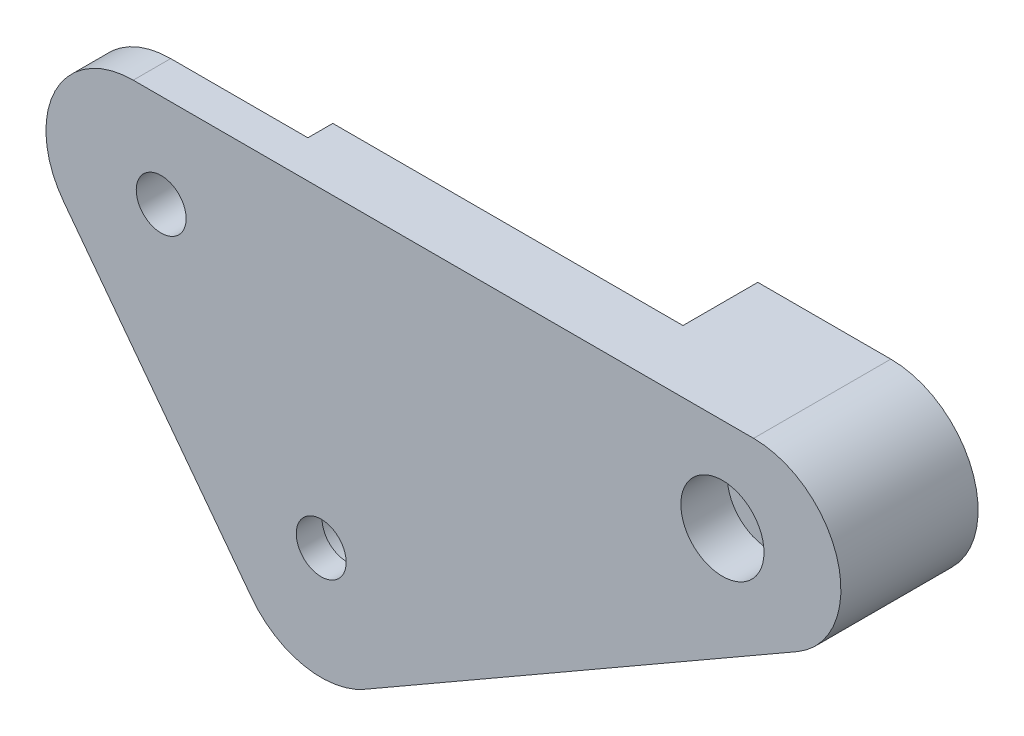
ISO-10303-21;
HEADER;
FILE_DESCRIPTION(('STEP AP214'),'2;1');
FILE_NAME('part.step','',(''),(''),'','','');
FILE_SCHEMA(('AUTOMOTIVE_DESIGN { 1 0 10303 214 1 1 1 1 }'));
ENDSEC;
DATA;
#1=APPLICATION_CONTEXT('core data for automotive mechanical design processes');
#2=APPLICATION_PROTOCOL_DEFINITION('international standard','automotive_design',2000,#1);
#3=PRODUCT_CONTEXT('',#1,'mechanical');
#4=PRODUCT('Part','Part','',(#3));
#5=PRODUCT_RELATED_PRODUCT_CATEGORY('part','',(#4));
#6=PRODUCT_DEFINITION_FORMATION('','',#4);
#7=PRODUCT_DEFINITION_CONTEXT('part definition',#1,'design');
#8=PRODUCT_DEFINITION('design','',#6,#7);
#9=PRODUCT_DEFINITION_SHAPE('','',#8);
#10=(LENGTH_UNIT() NAMED_UNIT(*) SI_UNIT(.MILLI.,.METRE.));
#11=(NAMED_UNIT(*) PLANE_ANGLE_UNIT() SI_UNIT($,.RADIAN.));
#12=(NAMED_UNIT(*) SI_UNIT($,.STERADIAN.) SOLID_ANGLE_UNIT());
#13=UNCERTAINTY_MEASURE_WITH_UNIT(LENGTH_MEASURE(1.E-05),#10,'distance_accuracy_value','');
#14=(GEOMETRIC_REPRESENTATION_CONTEXT(3) GLOBAL_UNCERTAINTY_ASSIGNED_CONTEXT((#13)) GLOBAL_UNIT_ASSIGNED_CONTEXT((#10,
#11,#12)) REPRESENTATION_CONTEXT('',''));
#15=CARTESIAN_POINT('',(0.,0.,0.));
#16=DIRECTION('',(0.,0.,1.));
#17=DIRECTION('',(1.,0.,0.));
#18=AXIS2_PLACEMENT_3D('',#15,#16,#17);
#19=CARTESIAN_POINT('',(23.4483219724554,-31.6020795456195,6.85227128710816));
#20=DIRECTION('',(0.,0.,-1.));
#21=DIRECTION('',(-1.,0.,0.));
#22=AXIS2_PLACEMENT_3D('',#19,#20,#21);
#23=CYLINDRICAL_SURFACE('',#22,5.);
#24=CARTESIAN_POINT('',(23.4483219724554,-31.6020795456195,3.75227128710816));
#25=DIRECTION('',(0.,0.,-1.));
#26=DIRECTION('',(-1.,0.,0.));
#27=AXIS2_PLACEMENT_3D('',#24,#25,#26);
#28=CIRCLE('',#27,5.);
#29=CARTESIAN_POINT('',(18.4483219724554,-31.6020795456195,3.75227128710816));
#30=VERTEX_POINT('',#29);
#31=EDGE_CURVE('E13',#30,#30,#28,.T.);
#32=ORIENTED_EDGE('',*,*,#31,.F.);
#33=EDGE_LOOP('',(#32));
#34=FACE_BOUND('',#33,.T.);
#35=CARTESIAN_POINT('',(23.4483219724554,-31.6020795456195,-0.247728712891836));
#36=DIRECTION('',(0.,0.,-1.));
#37=DIRECTION('',(-1.,0.,0.));
#38=AXIS2_PLACEMENT_3D('',#35,#36,#37);
#39=CIRCLE('',#38,5.);
#40=CARTESIAN_POINT('',(18.4483219724554,-31.6020795456195,-0.247728712891836));
#41=VERTEX_POINT('',#40);
#42=EDGE_CURVE('E54',#41,#41,#39,.T.);
#43=ORIENTED_EDGE('',*,*,#42,.T.);
#44=EDGE_LOOP('',(#43));
#45=FACE_BOUND('',#44,.T.);
#46=ADVANCED_FACE('F50',(#34,#45),#23,.F.);
#47=CARTESIAN_POINT('',(71.7040897001721,-5.42884237029408,-8.14772871289184));
#48=DIRECTION('',(0.,0.,1.));
#49=DIRECTION('',(1.,0.,0.));
#50=AXIS2_PLACEMENT_3D('',#47,#48,#49);
#51=CYLINDRICAL_SURFACE('',#50,2.6);
#52=CARTESIAN_POINT('',(71.7040897001721,-5.42884237029408,-8.14772871289184));
#53=DIRECTION('',(0.,0.,1.));
#54=DIRECTION('',(1.,0.,0.));
#55=AXIS2_PLACEMENT_3D('',#52,#53,#54);
#56=CIRCLE('',#55,2.6);
#57=CARTESIAN_POINT('',(74.3040897001721,-5.42884237029408,-8.14772871289184));
#58=VERTEX_POINT('',#57);
#59=EDGE_CURVE('E261',#58,#58,#56,.T.);
#60=ORIENTED_EDGE('',*,*,#59,.F.);
#61=EDGE_LOOP('',(#60));
#62=FACE_BOUND('',#61,.T.);
#63=CARTESIAN_POINT('',(71.7040897001721,-5.42884237029408,1.25227128710816));
#64=DIRECTION('',(0.,0.,1.));
#65=DIRECTION('',(1.,0.,0.));
#66=AXIS2_PLACEMENT_3D('',#63,#64,#65);
#67=CIRCLE('',#66,2.6);
#68=CARTESIAN_POINT('',(74.3040897001721,-5.42884237029408,1.25227128710816));
#69=VERTEX_POINT('',#68);
#70=EDGE_CURVE('E259',#69,#69,#67,.F.);
#71=ORIENTED_EDGE('',*,*,#70,.F.);
#72=EDGE_LOOP('',(#71));
#73=FACE_BOUND('',#72,.T.);
#74=ADVANCED_FACE('F335',(#62,#73),#51,.F.);
#75=CARTESIAN_POINT('',(71.7040897001721,-5.42884237029408,-30.8609321484883));
#76=DIRECTION('',(0.,0.,1.));
#77=DIRECTION('',(1.,0.,0.));
#78=AXIS2_PLACEMENT_3D('',#75,#76,#77);
#79=CYLINDRICAL_SURFACE('',#78,2.99999999999999);
#80=CARTESIAN_POINT('',(71.7040897001721,-5.42884237029408,-9.64772871289184));
#81=DIRECTION('',(0.,0.,-1.));
#82=DIRECTION('',(-1.,0.,0.));
#83=AXIS2_PLACEMENT_3D('',#80,#81,#82);
#84=CIRCLE('',#83,2.99999999999999);
#85=CARTESIAN_POINT('',(68.7040897001721,-5.42884237029408,-9.64772871289184));
#86=VERTEX_POINT('',#85);
#87=EDGE_CURVE('E180',#86,#86,#84,.F.);
#88=ORIENTED_EDGE('',*,*,#87,.F.);
#89=EDGE_LOOP('',(#88));
#90=FACE_BOUND('',#89,.T.);
#91=CARTESIAN_POINT('',(71.7040897001721,-5.42884237029408,-8.14772871289184));
#92=DIRECTION('',(0.,0.,1.));
#93=DIRECTION('',(1.,0.,0.));
#94=AXIS2_PLACEMENT_3D('',#91,#92,#93);
#95=CIRCLE('',#94,2.99999999999999);
#96=CARTESIAN_POINT('',(74.7040897001721,-5.42884237029408,-8.14772871289184));
#97=VERTEX_POINT('',#96);
#98=EDGE_CURVE('E59',#97,#97,#95,.F.);
#99=ORIENTED_EDGE('',*,*,#98,.F.);
#100=EDGE_LOOP('',(#99));
#101=FACE_BOUND('',#100,.T.);
#102=ADVANCED_FACE('F342',(#90,#101),#79,.F.);
#103=CARTESIAN_POINT('',(0.846333631842013,-4.67884237029409,6.85227128710816));
#104=DIRECTION('',(0.,0.,-1.));
#105=DIRECTION('',(-1.,0.,0.));
#106=AXIS2_PLACEMENT_3D('',#103,#104,#105);
#107=CYLINDRICAL_SURFACE('',#106,10.5);
#108=CARTESIAN_POINT('',(0.846333631842013,-4.67884237029409,2.35227128710816));
#109=DIRECTION('',(0.,0.,-1.));
#110=DIRECTION('',(-1.,0.,0.));
#111=AXIS2_PLACEMENT_3D('',#108,#109,#110);
#112=CIRCLE('',#111,10.5);
#113=CARTESIAN_POINT('',(-7.53217277724911,-11.0073991056658,2.35227128710816));
#114=VERTEX_POINT('',#113);
#115=CARTESIAN_POINT('',(0.846333631842012,5.82115762970592,2.35227128710816));
#116=VERTEX_POINT('',#115);
#117=EDGE_CURVE('E160',#114,#116,#112,.T.);
#118=ORIENTED_EDGE('',*,*,#117,.F.);
#119=DIRECTION('',(0.,0.,-1.));
#120=VECTOR('',#119,1.);
#121=CARTESIAN_POINT('',(-7.5321727772491,-11.0073991056658,6.85227128710816));
#122=LINE('',#121,#120);
#123=CARTESIAN_POINT('',(-7.5321727772491,-11.0073991056658,6.85227128710816));
#124=VERTEX_POINT('',#123);
#125=EDGE_CURVE('E242',#124,#114,#122,.T.);
#126=ORIENTED_EDGE('',*,*,#125,.F.);
#127=CARTESIAN_POINT('',(0.846333631842013,-4.67884237029409,6.85227128710816));
#128=DIRECTION('',(0.,0.,1.));
#129=DIRECTION('',(1.,0.,0.));
#130=AXIS2_PLACEMENT_3D('',#127,#128,#129);
#131=CIRCLE('',#130,10.5);
#132=CARTESIAN_POINT('',(0.846333631842013,5.82115762970591,6.85227128710816));
#133=VERTEX_POINT('',#132);
#134=EDGE_CURVE('E216',#133,#124,#131,.T.);
#135=ORIENTED_EDGE('',*,*,#134,.F.);
#136=DIRECTION('',(0.,0.,-1.));
#137=VECTOR('',#136,1.);
#138=CARTESIAN_POINT('',(0.846333631842013,5.82115762970591,6.85227128710816));
#139=LINE('',#138,#137);
#140=EDGE_CURVE('E245',#133,#116,#139,.T.);
#141=ORIENTED_EDGE('',*,*,#140,.T.);
#142=EDGE_LOOP('',(#118,#126,#135,#141));
#143=FACE_BOUND('',#142,.T.);
#144=ADVANCED_FACE('F304',(#143),#107,.T.);
#145=CARTESIAN_POINT('',(4.2040897001721,-5.42884237029408,-3.64772871289184));
#146=DIRECTION('',(0.,0.,1.));
#147=DIRECTION('',(1.,0.,0.));
#148=AXIS2_PLACEMENT_3D('',#145,#146,#147);
#149=CYLINDRICAL_SURFACE('',#148,3.);
#150=CARTESIAN_POINT('',(4.2040897001721,-5.42884237029408,6.85227128710816));
#151=DIRECTION('',(0.,0.,-1.));
#152=DIRECTION('',(-1.,0.,0.));
#153=AXIS2_PLACEMENT_3D('',#150,#151,#152);
#154=CIRCLE('',#153,3.);
#155=CARTESIAN_POINT('',(1.2040897001721,-5.42884237029408,6.85227128710816));
#156=VERTEX_POINT('',#155);
#157=EDGE_CURVE('E183',#156,#156,#154,.T.);
#158=ORIENTED_EDGE('',*,*,#157,.F.);
#159=EDGE_LOOP('',(#158));
#160=FACE_BOUND('',#159,.T.);
#161=CARTESIAN_POINT('',(4.2040897001721,-5.42884237029408,2.35227128710816));
#162=DIRECTION('',(0.,0.,-1.));
#163=DIRECTION('',(-1.,0.,0.));
#164=AXIS2_PLACEMENT_3D('',#161,#162,#163);
#165=CIRCLE('',#164,3.);
#166=CARTESIAN_POINT('',(1.2040897001721,-5.42884237029408,2.35227128710816));
#167=VERTEX_POINT('',#166);
#168=EDGE_CURVE('E163',#167,#167,#165,.T.);
#169=ORIENTED_EDGE('',*,*,#168,.T.);
#170=EDGE_LOOP('',(#169));
#171=FACE_BOUND('',#170,.T.);
#172=ADVANCED_FACE('F354',(#160,#171),#149,.F.);
#173=CARTESIAN_POINT('',(-20.2433256813829,5.82115762970591,-0.647728712891836));
#174=DIRECTION('',(0.,0.,1.));
#175=DIRECTION('',(1.,0.,0.));
#176=AXIS2_PLACEMENT_3D('',#173,#174,#175);
#177=PLANE('',#176);
#178=CARTESIAN_POINT('',(23.4483219724554,-31.6020795456195,-0.647728712891836));
#179=DIRECTION('',(0.,0.,-1.));
#180=DIRECTION('',(-1.,0.,0.));
#181=AXIS2_PLACEMENT_3D('',#178,#179,#180);
#182=CIRCLE('',#181,6.);
#183=CARTESIAN_POINT('',(17.4483219724554,-31.6020795456195,-0.647728712891836));
#184=VERTEX_POINT('',#183);
#185=EDGE_CURVE('E421',#184,#184,#182,.T.);
#186=ORIENTED_EDGE('',*,*,#185,.F.);
#187=EDGE_LOOP('',(#186));
#188=FACE_BOUND('',#187,.T.);
#189=DIRECTION('',(-0.602719689083023,0.797952991342011,0.));
#190=VECTOR('',#189,1.);
#191=CARTESIAN_POINT('',(-20.2433256813829,5.82115762970591,-0.647728712891836));
#192=LINE('',#191,#190);
#193=CARTESIAN_POINT('',(15.0698155633643,-40.9306362809913,-0.647728712891836));
#194=VERTEX_POINT('',#193);
#195=CARTESIAN_POINT('',(4.85962990139851,-27.4131615100606,-0.647728712891836));
#196=VERTEX_POINT('',#195);
#197=EDGE_CURVE('E229',#194,#196,#192,.T.);
#198=ORIENTED_EDGE('',*,*,#197,.T.);
#199=CARTESIAN_POINT('',(-11.9128395594619,-2.53979687669215,-0.647728712891836));
#200=DIRECTION('',(0.,0.,1.));
#201=DIRECTION('',(1.,0.,0.));
#202=AXIS2_PLACEMENT_3D('',#199,#200,#201);
#203=CIRCLE('',#202,30.);
#204=CARTESIAN_POINT('',(17.9059628449534,0.752470300563864,-0.647728712891837));
#205=VERTEX_POINT('',#204);
#206=EDGE_CURVE('E177',#196,#205,#203,.T.);
#207=ORIENTED_EDGE('',*,*,#206,.T.);
#208=DIRECTION('',(0.109742239241867,-0.993960080147176,0.));
#209=VECTOR('',#208,1.);
#210=CARTESIAN_POINT('',(16.8936278672703,9.92141529845145,-0.647728712891836));
#211=LINE('',#210,#209);
#212=CARTESIAN_POINT('',(17.346333631842,5.82115762970591,-0.647728712891836));
#213=VERTEX_POINT('',#212);
#214=EDGE_CURVE('E186',#213,#205,#211,.T.);
#215=ORIENTED_EDGE('',*,*,#214,.F.);
#216=DIRECTION('',(1.,0.,0.));
#217=VECTOR('',#216,1.);
#218=CARTESIAN_POINT('',(-20.2433256813829,5.82115762970591,-0.647728712891836));
#219=LINE('',#218,#217);
#220=CARTESIAN_POINT('',(59.4578018589853,5.82115762970591,-0.647728712891836));
#221=VERTEX_POINT('',#220);
#222=EDGE_CURVE('E169',#213,#221,#219,.T.);
#223=ORIENTED_EDGE('',*,*,#222,.T.);
#224=DIRECTION('',(0.295028017739321,0.955488602103033,0.));
#225=VECTOR('',#224,1.);
#226=CARTESIAN_POINT('',(52.520493675425,-16.6462641069127,-0.647728712891836));
#227=LINE('',#226,#225);
#228=CARTESIAN_POINT('',(55.9027737581034,-5.69228728504106,-0.647728712891836));
#229=VERTEX_POINT('',#228);
#230=EDGE_CURVE('E192',#229,#221,#227,.T.);
#231=ORIENTED_EDGE('',*,*,#230,.F.);
#232=CARTESIAN_POINT('',(70.2351027896488,-10.1177075511309,-0.647728712891836));
#233=DIRECTION('',(0.,0.,1.));
#234=DIRECTION('',(1.,0.,0.));
#235=AXIS2_PLACEMENT_3D('',#232,#233,#234);
#236=CIRCLE('',#235,15.);
#237=CARTESIAN_POINT('',(58.5933347754306,-19.5765255271322,-0.647728712891836));
#238=VERTEX_POINT('',#237);
#239=EDGE_CURVE('E255',#229,#238,#236,.T.);
#240=ORIENTED_EDGE('',*,*,#239,.T.);
#241=DIRECTION('',(-0.630587865066753,0.776117867614549,0.));
#242=VECTOR('',#241,1.);
#243=CARTESIAN_POINT('',(14.8147488480527,34.3054862263608,-0.647728712891836));
#244=LINE('',#243,#242);
#245=CARTESIAN_POINT('',(62.4234056778647,-24.2905180193521,-0.647728712891836));
#246=VERTEX_POINT('',#245);
#247=EDGE_CURVE('E188',#246,#238,#244,.T.);
#248=ORIENTED_EDGE('',*,*,#247,.F.);
#249=DIRECTION('',(-0.866762795461945,-0.498720619588757,0.));
#250=VECTOR('',#249,1.);
#251=CARTESIAN_POINT('',(13.3341789330212,-52.5356269528448,-0.647728712891836));
#252=LINE('',#251,#250);
#253=CARTESIAN_POINT('',(28.6848884781373,-43.7030888979699,-0.647728712891836));
#254=VERTEX_POINT('',#253);
#255=EDGE_CURVE('E213',#246,#254,#252,.T.);
#256=ORIENTED_EDGE('',*,*,#255,.T.);
#257=CARTESIAN_POINT('',(23.4483219724554,-34.6020795456195,-0.647728712891836));
#258=DIRECTION('',(0.,0.,1.));
#259=DIRECTION('',(1.,0.,0.));
#260=AXIS2_PLACEMENT_3D('',#257,#258,#259);
#261=CIRCLE('',#260,10.5);
#262=EDGE_CURVE('E232',#254,#194,#261,.F.);
#263=ORIENTED_EDGE('',*,*,#262,.T.);
#264=EDGE_LOOP('',(#198,#207,#215,#223,#231,#240,#248,#256,#263));
#265=FACE_BOUND('',#264,.T.);
#266=ADVANCED_FACE('F288',(#188,#265),#177,.F.);
#267=CARTESIAN_POINT('',(75.4540897001721,-4.67884237029409,6.85227128710816));
#268=DIRECTION('',(0.,0.,-1.));
#269=DIRECTION('',(-1.,0.,0.));
#270=AXIS2_PLACEMENT_3D('',#267,#268,#269);
#271=CYLINDRICAL_SURFACE('',#270,10.5);
#272=DIRECTION('',(0.,0.,-1.));
#273=VECTOR('',#272,1.);
#274=CARTESIAN_POINT('',(80.6906562058541,-13.7798517226445,6.85227128710816));
#275=LINE('',#274,#273);
#276=CARTESIAN_POINT('',(80.6906562058541,-13.7798517226445,6.85227128710816));
#277=VERTEX_POINT('',#276);
#278=CARTESIAN_POINT('',(80.6906562058541,-13.7798517226445,-9.64772871289184));
#279=VERTEX_POINT('',#278);
#280=EDGE_CURVE('E227',#277,#279,#275,.T.);
#281=ORIENTED_EDGE('',*,*,#280,.T.);
#282=CARTESIAN_POINT('',(75.4540897001721,-4.67884237029409,-9.64772871289184));
#283=DIRECTION('',(0.,0.,-1.));
#284=DIRECTION('',(-1.,0.,0.));
#285=AXIS2_PLACEMENT_3D('',#282,#283,#284);
#286=CIRCLE('',#285,10.5);
#287=CARTESIAN_POINT('',(75.4540897001721,5.82115762970591,-9.64772871289184));
#288=VERTEX_POINT('',#287);
#289=EDGE_CURVE('E197',#288,#279,#286,.T.);
#290=ORIENTED_EDGE('',*,*,#289,.F.);
#291=DIRECTION('',(0.,0.,-1.));
#292=VECTOR('',#291,1.);
#293=CARTESIAN_POINT('',(75.4540897001721,5.82115762970591,6.85227128710816));
#294=LINE('',#293,#292);
#295=CARTESIAN_POINT('',(75.4540897001721,5.82115762970591,6.85227128710816));
#296=VERTEX_POINT('',#295);
#297=EDGE_CURVE('E247',#296,#288,#294,.T.);
#298=ORIENTED_EDGE('',*,*,#297,.F.);
#299=CARTESIAN_POINT('',(75.4540897001721,-4.67884237029409,6.85227128710816));
#300=DIRECTION('',(0.,0.,1.));
#301=DIRECTION('',(1.,0.,0.));
#302=AXIS2_PLACEMENT_3D('',#299,#300,#301);
#303=CIRCLE('',#302,10.5);
#304=EDGE_CURVE('E209',#296,#277,#303,.F.);
#305=ORIENTED_EDGE('',*,*,#304,.T.);
#306=EDGE_LOOP('',(#281,#290,#298,#305));
#307=FACE_BOUND('',#306,.T.);
#308=ADVANCED_FACE('F314',(#307),#271,.T.);
#309=CARTESIAN_POINT('',(-20.2433256813829,5.82115762970591,6.85227128710816));
#310=DIRECTION('',(0.,1.,0.));
#311=DIRECTION('',(0.,0.,1.));
#312=AXIS2_PLACEMENT_3D('',#309,#310,#311);
#313=PLANE('',#312);
#314=DIRECTION('',(0.,0.,-1.));
#315=VECTOR('',#314,1.);
#316=CARTESIAN_POINT('',(17.346333631842,5.82115762970591,2.35227128710816));
#317=LINE('',#316,#315);
#318=CARTESIAN_POINT('',(17.346333631842,5.82115762970591,2.35227128710816));
#319=VERTEX_POINT('',#318);
#320=EDGE_CURVE('E151',#319,#213,#317,.T.);
#321=ORIENTED_EDGE('',*,*,#320,.F.);
#322=DIRECTION('',(1.,0.,0.));
#323=VECTOR('',#322,1.);
#324=CARTESIAN_POINT('',(0.846333631842012,5.82115762970591,2.35227128710816));
#325=LINE('',#324,#323);
#326=EDGE_CURVE('E155',#116,#319,#325,.T.);
#327=ORIENTED_EDGE('',*,*,#326,.F.);
#328=ORIENTED_EDGE('',*,*,#140,.F.);
#329=DIRECTION('',(1.,0.,0.));
#330=VECTOR('',#329,1.);
#331=CARTESIAN_POINT('',(-20.2433256813829,5.82115762970591,6.85227128710816));
#332=LINE('',#331,#330);
#333=EDGE_CURVE('E212',#133,#296,#332,.T.);
#334=ORIENTED_EDGE('',*,*,#333,.T.);
#335=ORIENTED_EDGE('',*,*,#297,.T.);
#336=DIRECTION('',(1.,0.,0.));
#337=VECTOR('',#336,1.);
#338=CARTESIAN_POINT('',(-20.2433256813829,5.82115762970591,-9.64772871289184));
#339=LINE('',#338,#337);
#340=CARTESIAN_POINT('',(59.4578018589853,5.82115762970591,-9.64772871289184));
#341=VERTEX_POINT('',#340);
#342=EDGE_CURVE('E194',#341,#288,#339,.T.);
#343=ORIENTED_EDGE('',*,*,#342,.F.);
#344=DIRECTION('',(0.,0.,1.));
#345=VECTOR('',#344,1.);
#346=CARTESIAN_POINT('',(59.4578018589853,5.82115762970591,-9.64772871289184));
#347=LINE('',#346,#345);
#348=EDGE_CURVE('E207',#341,#221,#347,.T.);
#349=ORIENTED_EDGE('',*,*,#348,.T.);
#350=ORIENTED_EDGE('',*,*,#222,.F.);
#351=EDGE_LOOP('',(#321,#327,#328,#334,#335,#343,#349,#350));
#352=FACE_BOUND('',#351,.T.);
#353=ADVANCED_FACE('F166',(#352),#313,.T.);
#354=CARTESIAN_POINT('',(-20.2433256813829,5.82115762970591,6.85227128710816));
#355=DIRECTION('',(-0.797952991342011,-0.602719689083023,0.));
#356=DIRECTION('',(0.602719689083023,-0.797952991342011,0.));
#357=AXIS2_PLACEMENT_3D('',#354,#355,#356);
#358=PLANE('',#357);
#359=DIRECTION('',(0.,0.,-1.));
#360=VECTOR('',#359,1.);
#361=CARTESIAN_POINT('',(4.85962990139851,-27.4131615100606,2.35227128710816));
#362=LINE('',#361,#360);
#363=CARTESIAN_POINT('',(4.85962990139849,-27.4131615100606,2.35227128710816));
#364=VERTEX_POINT('',#363);
#365=EDGE_CURVE('E171',#364,#196,#362,.T.);
#366=ORIENTED_EDGE('',*,*,#365,.T.);
#367=ORIENTED_EDGE('',*,*,#197,.F.);
#368=DIRECTION('',(0.,0.,-1.));
#369=VECTOR('',#368,1.);
#370=CARTESIAN_POINT('',(15.0698155633643,-40.9306362809913,6.85227128710816));
#371=LINE('',#370,#369);
#372=CARTESIAN_POINT('',(15.0698155633643,-40.9306362809913,6.85227128710816));
#373=VERTEX_POINT('',#372);
#374=EDGE_CURVE('E240',#373,#194,#371,.T.);
#375=ORIENTED_EDGE('',*,*,#374,.F.);
#376=DIRECTION('',(-0.602719689083023,0.797952991342011,0.));
#377=VECTOR('',#376,1.);
#378=CARTESIAN_POINT('',(-20.2433256813829,5.82115762970591,6.85227128710816));
#379=LINE('',#378,#377);
#380=EDGE_CURVE('E218',#373,#124,#379,.T.);
#381=ORIENTED_EDGE('',*,*,#380,.T.);
#382=ORIENTED_EDGE('',*,*,#125,.T.);
#383=DIRECTION('',(-0.602719689083023,0.797952991342011,0.));
#384=VECTOR('',#383,1.);
#385=CARTESIAN_POINT('',(4.85962990139849,-27.4131615100607,2.35227128710816));
#386=LINE('',#385,#384);
#387=EDGE_CURVE('E173',#364,#114,#386,.T.);
#388=ORIENTED_EDGE('',*,*,#387,.F.);
#389=EDGE_LOOP('',(#366,#367,#375,#381,#382,#388));
#390=FACE_BOUND('',#389,.T.);
#391=ADVANCED_FACE('F285',(#390),#358,.T.);
#392=CARTESIAN_POINT('',(23.4483219724554,-34.6020795456195,6.85227128710816));
#393=DIRECTION('',(0.,0.,-1.));
#394=DIRECTION('',(-1.,0.,0.));
#395=AXIS2_PLACEMENT_3D('',#392,#393,#394);
#396=CYLINDRICAL_SURFACE('',#395,10.5);
#397=ORIENTED_EDGE('',*,*,#262,.F.);
#398=DIRECTION('',(0.,0.,-1.));
#399=VECTOR('',#398,1.);
#400=CARTESIAN_POINT('',(28.6848884781373,-43.7030888979699,6.85227128710816));
#401=LINE('',#400,#399);
#402=CARTESIAN_POINT('',(28.6848884781373,-43.7030888979699,6.85227128710816));
#403=VERTEX_POINT('',#402);
#404=EDGE_CURVE('E237',#403,#254,#401,.T.);
#405=ORIENTED_EDGE('',*,*,#404,.F.);
#406=CARTESIAN_POINT('',(23.4483219724554,-34.6020795456195,6.85227128710816));
#407=DIRECTION('',(0.,0.,1.));
#408=DIRECTION('',(1.,0.,0.));
#409=AXIS2_PLACEMENT_3D('',#406,#407,#408);
#410=CIRCLE('',#409,10.5);
#411=EDGE_CURVE('E221',#403,#373,#410,.F.);
#412=ORIENTED_EDGE('',*,*,#411,.T.);
#413=ORIENTED_EDGE('',*,*,#374,.T.);
#414=EDGE_LOOP('',(#397,#405,#412,#413));
#415=FACE_BOUND('',#414,.T.);
#416=ADVANCED_FACE('F292',(#415),#396,.T.);
#417=CARTESIAN_POINT('',(13.3341789330212,-52.5356269528448,6.85227128710816));
#418=DIRECTION('',(0.498720619588757,-0.866762795461945,0.));
#419=DIRECTION('',(0.866762795461945,0.498720619588757,0.));
#420=AXIS2_PLACEMENT_3D('',#417,#418,#419);
#421=PLANE('',#420);
#422=ORIENTED_EDGE('',*,*,#255,.F.);
#423=DIRECTION('',(0.,0.,1.));
#424=VECTOR('',#423,1.);
#425=CARTESIAN_POINT('',(62.4234056778647,-24.2905180193521,-9.64772871289184));
#426=LINE('',#425,#424);
#427=CARTESIAN_POINT('',(62.4234056778647,-24.2905180193521,-9.64772871289184));
#428=VERTEX_POINT('',#427);
#429=EDGE_CURVE('E202',#428,#246,#426,.T.);
#430=ORIENTED_EDGE('',*,*,#429,.F.);
#431=DIRECTION('',(-0.866762795461945,-0.498720619588757,0.));
#432=VECTOR('',#431,1.);
#433=CARTESIAN_POINT('',(13.3341789330212,-52.5356269528448,-9.64772871289184));
#434=LINE('',#433,#432);
#435=EDGE_CURVE('E200',#279,#428,#434,.T.);
#436=ORIENTED_EDGE('',*,*,#435,.F.);
#437=ORIENTED_EDGE('',*,*,#280,.F.);
#438=DIRECTION('',(-0.866762795461945,-0.498720619588757,0.));
#439=VECTOR('',#438,1.);
#440=CARTESIAN_POINT('',(13.3341789330212,-52.5356269528448,6.85227128710816));
#441=LINE('',#440,#439);
#442=EDGE_CURVE('E224',#277,#403,#441,.T.);
#443=ORIENTED_EDGE('',*,*,#442,.T.);
#444=ORIENTED_EDGE('',*,*,#404,.T.);
#445=EDGE_LOOP('',(#422,#430,#436,#437,#443,#444));
#446=FACE_BOUND('',#445,.T.);
#447=ADVANCED_FACE('F316',(#446),#421,.T.);
#448=CARTESIAN_POINT('',(-20.2433256813829,5.82115762970591,6.85227128710816));
#449=DIRECTION('',(0.,0.,1.));
#450=DIRECTION('',(1.,0.,0.));
#451=AXIS2_PLACEMENT_3D('',#448,#449,#450);
#452=PLANE('',#451);
#453=CARTESIAN_POINT('',(71.7040897001721,-5.42884237029408,6.85227128710816));
#454=DIRECTION('',(0.,0.,1.));
#455=DIRECTION('',(1.,0.,0.));
#456=AXIS2_PLACEMENT_3D('',#453,#454,#455);
#457=CIRCLE('',#456,5.);
#458=CARTESIAN_POINT('',(76.7040897001721,-5.42884237029408,6.85227128710816));
#459=VERTEX_POINT('',#458);
#460=EDGE_CURVE('E268',#459,#459,#457,.T.);
#461=ORIENTED_EDGE('',*,*,#460,.F.);
#462=EDGE_LOOP('',(#461));
#463=FACE_BOUND('',#462,.T.);
#464=ORIENTED_EDGE('',*,*,#157,.T.);
#465=EDGE_LOOP('',(#464));
#466=FACE_BOUND('',#465,.T.);
#467=ORIENTED_EDGE('',*,*,#304,.F.);
#468=ORIENTED_EDGE('',*,*,#333,.F.);
#469=ORIENTED_EDGE('',*,*,#134,.T.);
#470=ORIENTED_EDGE('',*,*,#380,.F.);
#471=ORIENTED_EDGE('',*,*,#411,.F.);
#472=ORIENTED_EDGE('',*,*,#442,.F.);
#473=EDGE_LOOP('',(#467,#468,#469,#470,#471,#472));
#474=FACE_BOUND('',#473,.T.);
#475=CARTESIAN_POINT('',(23.4483219724554,-31.6020795456195,6.85227128710816));
#476=DIRECTION('',(0.,0.,1.));
#477=DIRECTION('',(1.,0.,0.));
#478=AXIS2_PLACEMENT_3D('',#475,#476,#477);
#479=CIRCLE('',#478,3.);
#480=CARTESIAN_POINT('',(20.4483219724554,-31.6020795456195,6.85227128710816));
#481=VERTEX_POINT('',#480);
#482=EDGE_CURVE('E273',#481,#481,#479,.F.);
#483=ORIENTED_EDGE('',*,*,#482,.T.);
#484=EDGE_LOOP('',(#483));
#485=FACE_BOUND('',#484,.T.);
#486=ADVANCED_FACE('F297',(#463,#466,#474,#485),#452,.T.);
#487=CARTESIAN_POINT('',(14.8147488480527,34.3054862263608,-9.64772871289184));
#488=DIRECTION('',(0.776117867614549,0.630587865066753,0.));
#489=DIRECTION('',(-0.630587865066753,0.776117867614549,0.));
#490=AXIS2_PLACEMENT_3D('',#487,#488,#489);
#491=PLANE('',#490);
#492=ORIENTED_EDGE('',*,*,#247,.T.);
#493=DIRECTION('',(0.,0.,1.));
#494=VECTOR('',#493,1.);
#495=CARTESIAN_POINT('',(58.5933347754306,-19.5765255271322,-9.64772871289184));
#496=LINE('',#495,#494);
#497=CARTESIAN_POINT('',(58.5933347754306,-19.5765255271322,-9.64772871289184));
#498=VERTEX_POINT('',#497);
#499=EDGE_CURVE('E74',#238,#498,#496,.F.);
#500=ORIENTED_EDGE('',*,*,#499,.T.);
#501=DIRECTION('',(-0.630587865066753,0.776117867614549,0.));
#502=VECTOR('',#501,1.);
#503=CARTESIAN_POINT('',(14.8147488480527,34.3054862263608,-9.64772871289184));
#504=LINE('',#503,#502);
#505=EDGE_CURVE('E189',#428,#498,#504,.T.);
#506=ORIENTED_EDGE('',*,*,#505,.F.);
#507=ORIENTED_EDGE('',*,*,#429,.T.);
#508=EDGE_LOOP('',(#492,#500,#506,#507));
#509=FACE_BOUND('',#508,.T.);
#510=ADVANCED_FACE('F364',(#509),#491,.F.);
#511=CARTESIAN_POINT('',(52.520493675425,-16.6462641069127,-9.64772871289184));
#512=DIRECTION('',(0.955488602103032,-0.295028017739321,0.));
#513=DIRECTION('',(0.295028017739321,0.955488602103033,0.));
#514=AXIS2_PLACEMENT_3D('',#511,#512,#513);
#515=PLANE('',#514);
#516=DIRECTION('',(0.295028017739321,0.955488602103033,0.));
#517=VECTOR('',#516,1.);
#518=CARTESIAN_POINT('',(52.520493675425,-16.6462641069127,-9.64772871289184));
#519=LINE('',#518,#517);
#520=CARTESIAN_POINT('',(55.9027737581034,-5.69228728504106,-9.64772871289184));
#521=VERTEX_POINT('',#520);
#522=EDGE_CURVE('E191',#521,#341,#519,.T.);
#523=ORIENTED_EDGE('',*,*,#522,.F.);
#524=DIRECTION('',(0.,0.,1.));
#525=VECTOR('',#524,1.);
#526=CARTESIAN_POINT('',(55.9027737581034,-5.69228728504107,-9.64772871289184));
#527=LINE('',#526,#525);
#528=EDGE_CURVE('E249',#521,#229,#527,.T.);
#529=ORIENTED_EDGE('',*,*,#528,.T.);
#530=ORIENTED_EDGE('',*,*,#230,.T.);
#531=ORIENTED_EDGE('',*,*,#348,.F.);
#532=EDGE_LOOP('',(#523,#529,#530,#531));
#533=FACE_BOUND('',#532,.T.);
#534=ADVANCED_FACE('F323',(#533),#515,.F.);
#535=CARTESIAN_POINT('',(-20.2433256813829,5.82115762970591,-9.64772871289184));
#536=DIRECTION('',(0.,0.,-1.));
#537=DIRECTION('',(-1.,0.,0.));
#538=AXIS2_PLACEMENT_3D('',#535,#536,#537);
#539=PLANE('',#538);
#540=ORIENTED_EDGE('',*,*,#505,.T.);
#541=CARTESIAN_POINT('',(70.2351027896488,-10.1177075511309,-9.64772871289184));
#542=DIRECTION('',(0.,0.,-1.));
#543=DIRECTION('',(-1.,0.,0.));
#544=AXIS2_PLACEMENT_3D('',#541,#542,#543);
#545=CIRCLE('',#544,15.);
#546=EDGE_CURVE('E253',#498,#521,#545,.T.);
#547=ORIENTED_EDGE('',*,*,#546,.T.);
#548=ORIENTED_EDGE('',*,*,#522,.T.);
#549=ORIENTED_EDGE('',*,*,#342,.T.);
#550=ORIENTED_EDGE('',*,*,#289,.T.);
#551=ORIENTED_EDGE('',*,*,#435,.T.);
#552=EDGE_LOOP('',(#540,#547,#548,#549,#550,#551));
#553=FACE_BOUND('',#552,.T.);
#554=ORIENTED_EDGE('',*,*,#87,.T.);
#555=EDGE_LOOP('',(#554));
#556=FACE_BOUND('',#555,.T.);
#557=ADVANCED_FACE('F309',(#553,#556),#539,.T.);
#558=CARTESIAN_POINT('',(70.2351027896488,-10.1177075511309,-9.64772871289184));
#559=DIRECTION('',(0.,0.,1.));
#560=DIRECTION('',(1.,0.,0.));
#561=AXIS2_PLACEMENT_3D('',#558,#559,#560);
#562=CYLINDRICAL_SURFACE('',#561,15.);
#563=ORIENTED_EDGE('',*,*,#546,.F.);
#564=ORIENTED_EDGE('',*,*,#499,.F.);
#565=ORIENTED_EDGE('',*,*,#239,.F.);
#566=ORIENTED_EDGE('',*,*,#528,.F.);
#567=EDGE_LOOP('',(#563,#564,#565,#566));
#568=FACE_BOUND('',#567,.T.);
#569=ADVANCED_FACE('F52',(#568),#562,.T.);
#570=CARTESIAN_POINT('',(-11.9128395594619,-2.53979687669215,2.35227128710816));
#571=DIRECTION('',(0.,0.,-1.));
#572=DIRECTION('',(-1.,0.,0.));
#573=AXIS2_PLACEMENT_3D('',#570,#571,#572);
#574=CYLINDRICAL_SURFACE('',#573,30.);
#575=ORIENTED_EDGE('',*,*,#365,.F.);
#576=CARTESIAN_POINT('',(-11.9128395594619,-2.53979687669215,2.35227128710816));
#577=DIRECTION('',(0.,0.,-1.));
#578=DIRECTION('',(-1.,0.,0.));
#579=AXIS2_PLACEMENT_3D('',#576,#577,#578);
#580=CIRCLE('',#579,30.);
#581=CARTESIAN_POINT('',(17.9059628449534,0.752470300563864,2.35227128710816));
#582=VERTEX_POINT('',#581);
#583=EDGE_CURVE('E66',#582,#364,#580,.T.);
#584=ORIENTED_EDGE('',*,*,#583,.F.);
#585=DIRECTION('',(0.,0.,-1.));
#586=VECTOR('',#585,1.);
#587=CARTESIAN_POINT('',(17.9059628449534,0.752470300563864,2.35227128710816));
#588=LINE('',#587,#586);
#589=EDGE_CURVE('E154',#582,#205,#588,.T.);
#590=ORIENTED_EDGE('',*,*,#589,.T.);
#591=ORIENTED_EDGE('',*,*,#206,.F.);
#592=EDGE_LOOP('',(#575,#584,#590,#591));
#593=FACE_BOUND('',#592,.T.);
#594=ADVANCED_FACE('F324',(#593),#574,.F.);
#595=CARTESIAN_POINT('',(17.346333631842,5.82115762970591,2.35227128710816));
#596=DIRECTION('',(0.993960080147176,0.109742239241867,0.));
#597=DIRECTION('',(-0.109742239241867,0.993960080147176,0.));
#598=AXIS2_PLACEMENT_3D('',#595,#596,#597);
#599=PLANE('',#598);
#600=ORIENTED_EDGE('',*,*,#589,.F.);
#601=DIRECTION('',(0.109742239241867,-0.993960080147176,0.));
#602=VECTOR('',#601,1.);
#603=CARTESIAN_POINT('',(17.346333631842,5.82115762970591,2.35227128710816));
#604=LINE('',#603,#602);
#605=EDGE_CURVE('E147',#319,#582,#604,.T.);
#606=ORIENTED_EDGE('',*,*,#605,.F.);
#607=ORIENTED_EDGE('',*,*,#320,.T.);
#608=ORIENTED_EDGE('',*,*,#214,.T.);
#609=EDGE_LOOP('',(#600,#606,#607,#608));
#610=FACE_BOUND('',#609,.T.);
#611=ADVANCED_FACE('F149',(#610),#599,.F.);
#612=CARTESIAN_POINT('',(-11.9128395594619,-2.53979687669215,2.35227128710816));
#613=DIRECTION('',(0.,0.,-1.));
#614=DIRECTION('',(-1.,0.,0.));
#615=AXIS2_PLACEMENT_3D('',#612,#613,#614);
#616=PLANE('',#615);
#617=ORIENTED_EDGE('',*,*,#168,.F.);
#618=EDGE_LOOP('',(#617));
#619=FACE_BOUND('',#618,.T.);
#620=ORIENTED_EDGE('',*,*,#326,.T.);
#621=ORIENTED_EDGE('',*,*,#605,.T.);
#622=ORIENTED_EDGE('',*,*,#583,.T.);
#623=ORIENTED_EDGE('',*,*,#387,.T.);
#624=ORIENTED_EDGE('',*,*,#117,.T.);
#625=EDGE_LOOP('',(#620,#621,#622,#623,#624));
#626=FACE_BOUND('',#625,.T.);
#627=ADVANCED_FACE('F158',(#619,#626),#616,.T.);
#628=CARTESIAN_POINT('',(71.7040897001721,-5.42884237029408,-8.14772871289184));
#629=DIRECTION('',(0.,0.,1.));
#630=DIRECTION('',(1.,0.,0.));
#631=AXIS2_PLACEMENT_3D('',#628,#629,#630);
#632=PLANE('',#631);
#633=ORIENTED_EDGE('',*,*,#59,.T.);
#634=EDGE_LOOP('',(#633));
#635=FACE_BOUND('',#634,.T.);
#636=ORIENTED_EDGE('',*,*,#98,.T.);
#637=EDGE_LOOP('',(#636));
#638=FACE_BOUND('',#637,.T.);
#639=ADVANCED_FACE('F385',(#635,#638),#632,.F.);
#640=CARTESIAN_POINT('',(71.7040897001721,-5.42884237029408,1.25227128710816));
#641=DIRECTION('',(0.,0.,1.));
#642=DIRECTION('',(1.,0.,0.));
#643=AXIS2_PLACEMENT_3D('',#640,#641,#642);
#644=PLANE('',#643);
#645=CARTESIAN_POINT('',(71.7040897001721,-5.42884237029408,1.25227128710816));
#646=DIRECTION('',(0.,0.,1.));
#647=DIRECTION('',(1.,0.,0.));
#648=AXIS2_PLACEMENT_3D('',#645,#646,#647);
#649=CIRCLE('',#648,5.);
#650=CARTESIAN_POINT('',(76.7040897001721,-5.42884237029408,1.25227128710816));
#651=VERTEX_POINT('',#650);
#652=EDGE_CURVE('E262',#651,#651,#649,.T.);
#653=ORIENTED_EDGE('',*,*,#652,.T.);
#654=EDGE_LOOP('',(#653));
#655=FACE_BOUND('',#654,.T.);
#656=ORIENTED_EDGE('',*,*,#70,.T.);
#657=EDGE_LOOP('',(#656));
#658=FACE_BOUND('',#657,.T.);
#659=ADVANCED_FACE('F386',(#655,#658),#644,.T.);
#660=CARTESIAN_POINT('',(71.7040897001721,-5.42884237029408,1.25227128710816));
#661=DIRECTION('',(0.,0.,1.));
#662=DIRECTION('',(1.,0.,0.));
#663=AXIS2_PLACEMENT_3D('',#660,#661,#662);
#664=CYLINDRICAL_SURFACE('',#663,5.);
#665=ORIENTED_EDGE('',*,*,#652,.F.);
#666=EDGE_LOOP('',(#665));
#667=FACE_BOUND('',#666,.T.);
#668=ORIENTED_EDGE('',*,*,#460,.T.);
#669=EDGE_LOOP('',(#668));
#670=FACE_BOUND('',#669,.T.);
#671=ADVANCED_FACE('F392',(#667,#670),#664,.F.);
#672=CARTESIAN_POINT('',(23.4483219724554,-31.6020795456195,20.9944069108391));
#673=DIRECTION('',(0.,0.,-1.));
#674=DIRECTION('',(-1.,0.,0.));
#675=AXIS2_PLACEMENT_3D('',#672,#673,#674);
#676=CYLINDRICAL_SURFACE('',#675,3.);
#677=CARTESIAN_POINT('',(23.4483219724554,-31.6020795456195,3.75227128710816));
#678=DIRECTION('',(0.,0.,-1.));
#679=DIRECTION('',(-1.,0.,0.));
#680=AXIS2_PLACEMENT_3D('',#677,#678,#679);
#681=CIRCLE('',#680,3.);
#682=CARTESIAN_POINT('',(20.4483219724554,-31.6020795456195,3.75227128710816));
#683=VERTEX_POINT('',#682);
#684=EDGE_CURVE('E423',#683,#683,#681,.T.);
#685=CARTESIAN_POINT('',(20.4483219724554,-31.6020795456195,3.75227128710816));
#686=CARTESIAN_POINT('',(20.4483219724554,-31.6020795456195,3.78456295377483));
#687=CARTESIAN_POINT('',(20.4483219724554,-31.6020795456195,3.81685462044149));
#688=CARTESIAN_POINT('',(20.4483219724554,-31.6020795456195,3.88143795377483));
#689=CARTESIAN_POINT('',(20.4483219724554,-31.6020795456195,3.91372962044149));
#690=CARTESIAN_POINT('',(20.4483219724554,-31.6020795456195,3.97831295377483));
#691=CARTESIAN_POINT('',(20.4483219724554,-31.6020795456195,4.01060462044149));
#692=CARTESIAN_POINT('',(20.4483219724554,-31.6020795456195,4.07518795377483));
#693=CARTESIAN_POINT('',(20.4483219724554,-31.6020795456195,4.10747962044149));
#694=CARTESIAN_POINT('',(20.4483219724554,-31.6020795456195,4.17206295377483));
#695=CARTESIAN_POINT('',(20.4483219724554,-31.6020795456195,4.20435462044149));
#696=CARTESIAN_POINT('',(20.4483219724554,-31.6020795456195,4.26893795377483));
#697=CARTESIAN_POINT('',(20.4483219724554,-31.6020795456195,4.3012296204415));
#698=CARTESIAN_POINT('',(20.4483219724554,-31.6020795456195,4.36581295377483));
#699=CARTESIAN_POINT('',(20.4483219724554,-31.6020795456195,4.3981046204415));
#700=CARTESIAN_POINT('',(20.4483219724554,-31.6020795456195,4.46268795377483));
#701=CARTESIAN_POINT('',(20.4483219724554,-31.6020795456195,4.4949796204415));
#702=CARTESIAN_POINT('',(20.4483219724554,-31.6020795456195,4.55956295377483));
#703=CARTESIAN_POINT('',(20.4483219724554,-31.6020795456195,4.5918546204415));
#704=CARTESIAN_POINT('',(20.4483219724554,-31.6020795456195,4.65643795377483));
#705=CARTESIAN_POINT('',(20.4483219724554,-31.6020795456195,4.6887296204415));
#706=CARTESIAN_POINT('',(20.4483219724554,-31.6020795456195,4.75331295377483));
#707=CARTESIAN_POINT('',(20.4483219724554,-31.6020795456195,4.7856046204415));
#708=CARTESIAN_POINT('',(20.4483219724554,-31.6020795456195,4.85018795377483));
#709=CARTESIAN_POINT('',(20.4483219724554,-31.6020795456195,4.8824796204415));
#710=CARTESIAN_POINT('',(20.4483219724554,-31.6020795456195,4.94706295377483));
#711=CARTESIAN_POINT('',(20.4483219724554,-31.6020795456195,4.9793546204415));
#712=CARTESIAN_POINT('',(20.4483219724554,-31.6020795456195,5.04393795377483));
#713=CARTESIAN_POINT('',(20.4483219724554,-31.6020795456195,5.0762296204415));
#714=CARTESIAN_POINT('',(20.4483219724554,-31.6020795456195,5.14081295377483));
#715=CARTESIAN_POINT('',(20.4483219724554,-31.6020795456195,5.17310462044149));
#716=CARTESIAN_POINT('',(20.4483219724554,-31.6020795456195,5.23768795377483));
#717=CARTESIAN_POINT('',(20.4483219724554,-31.6020795456195,5.2699796204415));
#718=CARTESIAN_POINT('',(20.4483219724554,-31.6020795456195,5.33456295377483));
#719=CARTESIAN_POINT('',(20.4483219724554,-31.6020795456195,5.36685462044149));
#720=CARTESIAN_POINT('',(20.4483219724554,-31.6020795456195,5.43143795377483));
#721=CARTESIAN_POINT('',(20.4483219724554,-31.6020795456195,5.46372962044149));
#722=CARTESIAN_POINT('',(20.4483219724554,-31.6020795456195,5.52831295377483));
#723=CARTESIAN_POINT('',(20.4483219724554,-31.6020795456195,5.56060462044149));
#724=CARTESIAN_POINT('',(20.4483219724554,-31.6020795456195,5.62518795377483));
#725=CARTESIAN_POINT('',(20.4483219724554,-31.6020795456195,5.65747962044149));
#726=CARTESIAN_POINT('',(20.4483219724554,-31.6020795456195,5.72206295377483));
#727=CARTESIAN_POINT('',(20.4483219724554,-31.6020795456195,5.75435462044149));
#728=CARTESIAN_POINT('',(20.4483219724554,-31.6020795456195,5.81893795377483));
#729=CARTESIAN_POINT('',(20.4483219724554,-31.6020795456195,5.85122962044149));
#730=CARTESIAN_POINT('',(20.4483219724554,-31.6020795456195,5.91581295377483));
#731=CARTESIAN_POINT('',(20.4483219724554,-31.6020795456195,5.94810462044149));
#732=CARTESIAN_POINT('',(20.4483219724554,-31.6020795456195,6.01268795377483));
#733=CARTESIAN_POINT('',(20.4483219724554,-31.6020795456195,6.04497962044149));
#734=CARTESIAN_POINT('',(20.4483219724554,-31.6020795456195,6.10956295377483));
#735=CARTESIAN_POINT('',(20.4483219724554,-31.6020795456195,6.14185462044149));
#736=CARTESIAN_POINT('',(20.4483219724554,-31.6020795456195,6.20643795377483));
#737=CARTESIAN_POINT('',(20.4483219724554,-31.6020795456195,6.23872962044149));
#738=CARTESIAN_POINT('',(20.4483219724554,-31.6020795456195,6.30331295377483));
#739=CARTESIAN_POINT('',(20.4483219724554,-31.6020795456195,6.33560462044149));
#740=CARTESIAN_POINT('',(20.4483219724554,-31.6020795456195,6.40018795377483));
#741=CARTESIAN_POINT('',(20.4483219724554,-31.6020795456195,6.43247962044149));
#742=CARTESIAN_POINT('',(20.4483219724554,-31.6020795456195,6.49706295377483));
#743=CARTESIAN_POINT('',(20.4483219724554,-31.6020795456195,6.5293546204415));
#744=CARTESIAN_POINT('',(20.4483219724554,-31.6020795456195,6.59393795377483));
#745=CARTESIAN_POINT('',(20.4483219724554,-31.6020795456195,6.6262296204415));
#746=CARTESIAN_POINT('',(20.4483219724554,-31.6020795456195,6.69081295377483));
#747=CARTESIAN_POINT('',(20.4483219724554,-31.6020795456195,6.7231046204415));
#748=CARTESIAN_POINT('',(20.4483219724554,-31.6020795456195,6.78768795377483));
#749=CARTESIAN_POINT('',(20.4483219724554,-31.6020795456195,6.8199796204415));
#750=CARTESIAN_POINT('',(20.4483219724554,-31.6020795456195,6.85227128710816));
#751=B_SPLINE_CURVE_WITH_KNOTS('',3,(#685,#686,#687,#688,#689,#690,#691,#692,#693,#694,#695,
#696,#697,#698,#699,#700,#701,#702,#703,#704,#705,#706,#707,#708,#709,#710,#711,#712,#713,#714,
#715,#716,#717,#718,#719,#720,#721,#722,#723,#724,#725,#726,#727,#728,#729,#730,#731,#732,#733,
#734,#735,#736,#737,#738,#739,#740,#741,#742,#743,#744,#745,#746,#747,#748,#749,#750),
.UNSPECIFIED.,.F.,.F.,(4,2,2,2,2,2,2,2,2,2,2,2,2,2,2,2,2,2,2,2,2,2,2,2,2,2,2,2,2,2,2,2,4),(0.,
0.0968749999999997,0.193749999999999,0.290624999999999,0.387499999999999,0.484374999999999,
0.581250000000002,0.678125000000002,0.775000000000001,0.871875000000001,0.968750000000001,
1.065625,1.1625,1.259375,1.35625,1.453125,1.55,1.646875,1.74375,1.840625,1.9375,2.034375,
2.13125,2.228125,2.325,2.421875,2.51875,2.615625,2.7125,2.809375,2.90625,3.003125,3.1),.UNSPECIFIED.);
#752=EDGE_CURVE('BSEAM397',#683,#481,#751,.T.);
#753=ORIENTED_EDGE('',*,*,#684,.T.);
#754=ORIENTED_EDGE('',*,*,#482,.F.);
#755=ORIENTED_EDGE('',*,*,#752,.T.);
#756=ORIENTED_EDGE('',*,*,#752,.F.);
#757=EDGE_LOOP('',(#753,#755,#754,#756));
#758=FACE_BOUND('',#757,.T.);
#759=ADVANCED_FACE('F397',(#758),#676,.F.);
#760=CARTESIAN_POINT('',(23.4483219724554,-31.6020795456195,3.75227128710816));
#761=DIRECTION('',(0.,0.,-1.));
#762=DIRECTION('',(-1.,0.,0.));
#763=AXIS2_PLACEMENT_3D('',#760,#761,#762);
#764=PLANE('',#763);
#765=ORIENTED_EDGE('',*,*,#684,.F.);
#766=EDGE_LOOP('',(#765));
#767=FACE_BOUND('',#766,.T.);
#768=ORIENTED_EDGE('',*,*,#31,.T.);
#769=EDGE_LOOP('',(#768));
#770=FACE_BOUND('',#769,.T.);
#771=ADVANCED_FACE('F402',(#767,#770),#764,.T.);
#772=CARTESIAN_POINT('',(23.4483219724554,-31.6020795456195,-0.247728712891836));
#773=DIRECTION('',(0.,0.,-1.));
#774=DIRECTION('',(-1.,0.,0.));
#775=AXIS2_PLACEMENT_3D('',#772,#773,#774);
#776=CYLINDRICAL_SURFACE('',#775,6.);
#777=CARTESIAN_POINT('',(23.4483219724554,-31.6020795456195,-0.247728712891836));
#778=DIRECTION('',(0.,0.,-1.));
#779=DIRECTION('',(-1.,0.,0.));
#780=AXIS2_PLACEMENT_3D('',#777,#778,#779);
#781=CIRCLE('',#780,6.);
#782=CARTESIAN_POINT('',(17.4483219724554,-31.6020795456195,-0.247728712891836));
#783=VERTEX_POINT('',#782);
#784=EDGE_CURVE('E420',#783,#783,#781,.T.);
#785=ORIENTED_EDGE('',*,*,#784,.F.);
#786=EDGE_LOOP('',(#785));
#787=FACE_BOUND('',#786,.T.);
#788=ORIENTED_EDGE('',*,*,#185,.T.);
#789=EDGE_LOOP('',(#788));
#790=FACE_BOUND('',#789,.T.);
#791=ADVANCED_FACE('F405',(#787,#790),#776,.F.);
#792=CARTESIAN_POINT('',(23.4483219724554,-31.6020795456195,-0.247728712891836));
#793=DIRECTION('',(0.,0.,-1.));
#794=DIRECTION('',(-1.,0.,0.));
#795=AXIS2_PLACEMENT_3D('',#792,#793,#794);
#796=PLANE('',#795);
#797=ORIENTED_EDGE('',*,*,#42,.F.);
#798=EDGE_LOOP('',(#797));
#799=FACE_BOUND('',#798,.T.);
#800=ORIENTED_EDGE('',*,*,#784,.T.);
#801=EDGE_LOOP('',(#800));
#802=FACE_BOUND('',#801,.T.);
#803=ADVANCED_FACE('F409',(#799,#802),#796,.T.);
#804=CLOSED_SHELL('',(#46,#74,#102,#144,#172,#266,#308,#353,#391,#416,#447,#486,#510,#534,#557,
#569,#594,#611,#627,#639,#659,#671,#759,#771,#791,#803));
#805=MANIFOLD_SOLID_BREP('B2',#804);
#806=ADVANCED_BREP_SHAPE_REPRESENTATION('',(#18,#805),#14);
#807=SHAPE_DEFINITION_REPRESENTATION(#9,#806);
ENDSEC;
END-ISO-10303-21;
